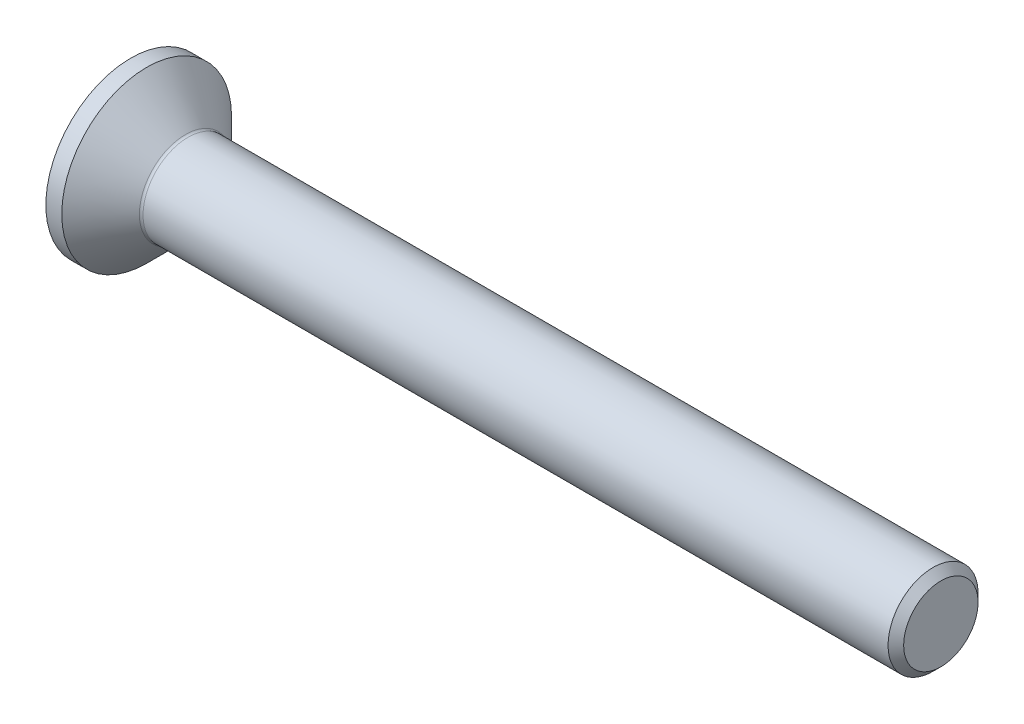
ISO-10303-21;
HEADER;
FILE_DESCRIPTION(('STEP AP214'),'2;1');
FILE_NAME('part.step','',(''),(''),'','','');
FILE_SCHEMA(('AUTOMOTIVE_DESIGN { 1 0 10303 214 1 1 1 1 }'));
ENDSEC;
DATA;
#1=APPLICATION_CONTEXT('core data for automotive mechanical design processes');
#2=APPLICATION_PROTOCOL_DEFINITION('international standard','automotive_design',2000,#1);
#3=PRODUCT_CONTEXT('',#1,'mechanical');
#4=PRODUCT('Part','Part','',(#3));
#5=PRODUCT_RELATED_PRODUCT_CATEGORY('part','',(#4));
#6=PRODUCT_DEFINITION_FORMATION('','',#4);
#7=PRODUCT_DEFINITION_CONTEXT('part definition',#1,'design');
#8=PRODUCT_DEFINITION('design','',#6,#7);
#9=PRODUCT_DEFINITION_SHAPE('','',#8);
#10=(LENGTH_UNIT() NAMED_UNIT(*) SI_UNIT(.MILLI.,.METRE.));
#11=(NAMED_UNIT(*) PLANE_ANGLE_UNIT() SI_UNIT($,.RADIAN.));
#12=(NAMED_UNIT(*) SI_UNIT($,.STERADIAN.) SOLID_ANGLE_UNIT());
#13=UNCERTAINTY_MEASURE_WITH_UNIT(LENGTH_MEASURE(1.E-05),#10,'distance_accuracy_value','');
#14=(GEOMETRIC_REPRESENTATION_CONTEXT(3) GLOBAL_UNCERTAINTY_ASSIGNED_CONTEXT((#13)) GLOBAL_UNIT_ASSIGNED_CONTEXT((#10,
#11,#12)) REPRESENTATION_CONTEXT('',''));
#15=CARTESIAN_POINT('',(0.,0.,0.));
#16=DIRECTION('',(0.,0.,1.));
#17=DIRECTION('',(1.,0.,0.));
#18=AXIS2_PLACEMENT_3D('',#15,#16,#17);
#19=CARTESIAN_POINT('',(3.1,0.,0.));
#20=DIRECTION('',(-1.,0.,0.));
#21=DIRECTION('',(0.,0.,1.));
#22=AXIS2_PLACEMENT_3D('',#19,#20,#21);
#23=CONICAL_SURFACE('',#22,2.5,0.785398163397448);
#24=CARTESIAN_POINT('',(0.884999999999991,0.,0.));
#25=DIRECTION('',(-1.,0.,0.));
#26=DIRECTION('',(0.,0.,1.));
#27=AXIS2_PLACEMENT_3D('',#24,#25,#26);
#28=CIRCLE('',#27,4.715);
#29=CARTESIAN_POINT('',(0.884999999999991,0.,4.715));
#30=VERTEX_POINT('',#29);
#31=EDGE_CURVE('E42',#30,#30,#28,.F.);
#32=ORIENTED_EDGE('',*,*,#31,.T.);
#33=EDGE_LOOP('',(#32));
#34=FACE_BOUND('',#33,.T.);
#35=CARTESIAN_POINT('',(3.04142135623731,0.,0.));
#36=DIRECTION('',(-1.,0.,0.));
#37=DIRECTION('',(0.,0.,1.));
#38=AXIS2_PLACEMENT_3D('',#35,#36,#37);
#39=CIRCLE('',#38,2.55857864376269);
#40=CARTESIAN_POINT('',(3.04142135623731,0.,2.55857864376269));
#41=VERTEX_POINT('',#40);
#42=EDGE_CURVE('E161',#41,#41,#39,.T.);
#43=ORIENTED_EDGE('',*,*,#42,.T.);
#44=EDGE_LOOP('',(#43));
#45=FACE_BOUND('',#44,.T.);
#46=ADVANCED_FACE('F38',(#34,#45),#23,.T.);
#47=CARTESIAN_POINT('',(-0.587069180985524,0.,0.));
#48=DIRECTION('',(-1.,0.,0.));
#49=DIRECTION('',(0.,0.,1.));
#50=AXIS2_PLACEMENT_3D('',#47,#48,#49);
#51=CYLINDRICAL_SURFACE('',#50,2.5);
#52=CARTESIAN_POINT('',(44.567,0.,0.));
#53=DIRECTION('',(-1.,0.,0.));
#54=DIRECTION('',(0.,0.,1.));
#55=AXIS2_PLACEMENT_3D('',#52,#53,#54);
#56=CIRCLE('',#55,2.5);
#57=CARTESIAN_POINT('',(44.567,0.,2.5));
#58=VERTEX_POINT('',#57);
#59=EDGE_CURVE('E47',#58,#58,#56,.T.);
#60=ORIENTED_EDGE('',*,*,#59,.T.);
#61=EDGE_LOOP('',(#60));
#62=FACE_BOUND('',#61,.T.);
#63=CARTESIAN_POINT('',(3.18284271247462,0.,0.));
#64=DIRECTION('',(-1.,0.,0.));
#65=DIRECTION('',(0.,0.,1.));
#66=AXIS2_PLACEMENT_3D('',#63,#64,#65);
#67=CIRCLE('',#66,2.5);
#68=CARTESIAN_POINT('',(3.18284271247462,0.,2.5));
#69=VERTEX_POINT('',#68);
#70=EDGE_CURVE('E158',#69,#69,#67,.F.);
#71=ORIENTED_EDGE('',*,*,#70,.T.);
#72=EDGE_LOOP('',(#71));
#73=FACE_BOUND('',#72,.T.);
#74=ADVANCED_FACE('F129',(#62,#73),#51,.T.);
#75=CARTESIAN_POINT('',(45.,2.5,0.));
#76=DIRECTION('',(-1.,0.,0.));
#77=DIRECTION('',(0.,0.,1.));
#78=AXIS2_PLACEMENT_3D('',#75,#76,#77);
#79=PLANE('',#78);
#80=CARTESIAN_POINT('',(45.,0.,0.));
#81=DIRECTION('',(-1.,0.,0.));
#82=DIRECTION('',(0.,0.,1.));
#83=AXIS2_PLACEMENT_3D('',#80,#81,#82);
#84=CIRCLE('',#83,2.06699999999999);
#85=CARTESIAN_POINT('',(45.,0.,2.06699999999999));
#86=VERTEX_POINT('',#85);
#87=EDGE_CURVE('E11',#86,#86,#84,.F.);
#88=ORIENTED_EDGE('',*,*,#87,.T.);
#89=EDGE_LOOP('',(#88));
#90=FACE_BOUND('',#89,.T.);
#91=ADVANCED_FACE('F135',(#90),#79,.F.);
#92=CARTESIAN_POINT('',(3.18284271247462,0.,0.));
#93=DIRECTION('',(-1.,0.,0.));
#94=DIRECTION('',(0.,0.,1.));
#95=AXIS2_PLACEMENT_3D('',#92,#93,#94);
#96=TOROIDAL_SURFACE('',#95,2.7,0.2);
#97=ORIENTED_EDGE('',*,*,#70,.F.);
#98=EDGE_LOOP('',(#97));
#99=FACE_BOUND('',#98,.T.);
#100=ORIENTED_EDGE('',*,*,#42,.F.);
#101=EDGE_LOOP('',(#100));
#102=FACE_BOUND('',#101,.T.);
#103=ADVANCED_FACE('F146',(#99,#102),#96,.F.);
#104=CARTESIAN_POINT('',(44.567,0.,0.));
#105=DIRECTION('',(-1.,0.,0.));
#106=DIRECTION('',(0.,0.,1.));
#107=AXIS2_PLACEMENT_3D('',#104,#105,#106);
#108=CONICAL_SURFACE('',#107,2.5,0.78539816339744);
#109=ORIENTED_EDGE('',*,*,#87,.F.);
#110=EDGE_LOOP('',(#109));
#111=FACE_BOUND('',#110,.T.);
#112=ORIENTED_EDGE('',*,*,#59,.F.);
#113=EDGE_LOOP('',(#112));
#114=FACE_BOUND('',#113,.T.);
#115=ADVANCED_FACE('F40',(#111,#114),#108,.T.);
#116=CARTESIAN_POINT('',(11.8531386861314,0.,0.));
#117=DIRECTION('',(1.,0.,0.));
#118=DIRECTION('',(0.,0.,-1.));
#119=AXIS2_PLACEMENT_3D('',#116,#117,#118);
#120=CYLINDRICAL_SURFACE('',#119,4.715);
#121=ORIENTED_EDGE('',*,*,#31,.F.);
#122=EDGE_LOOP('',(#121));
#123=FACE_BOUND('',#122,.T.);
#124=CARTESIAN_POINT('',(0.,0.,0.));
#125=DIRECTION('',(1.,0.,0.));
#126=DIRECTION('',(0.,0.,-1.));
#127=AXIS2_PLACEMENT_3D('',#124,#125,#126);
#128=CIRCLE('',#127,4.715);
#129=CARTESIAN_POINT('',(0.,0.,-4.715));
#130=VERTEX_POINT('',#129);
#131=EDGE_CURVE('E227',#130,#130,#128,.F.);
#132=ORIENTED_EDGE('',*,*,#131,.F.);
#133=EDGE_LOOP('',(#132));
#134=FACE_BOUND('',#133,.T.);
#135=ADVANCED_FACE('F116',(#123,#134),#120,.T.);
#136=CARTESIAN_POINT('',(2.76602540378444,0.,0.));
#137=DIRECTION('',(-1.,0.,0.));
#138=DIRECTION('',(0.,0.,1.));
#139=AXIS2_PLACEMENT_3D('',#136,#137,#138);
#140=CONICAL_SURFACE('',#139,0.,1.0471975511966);
#141=CARTESIAN_POINT('',(1.9,0.,0.));
#142=DIRECTION('',(-1.,0.,0.));
#143=DIRECTION('',(0.,0.,1.));
#144=AXIS2_PLACEMENT_3D('',#141,#142,#143);
#145=CIRCLE('',#144,1.5);
#146=CARTESIAN_POINT('',(1.9,0.75,1.29903810567666));
#147=VERTEX_POINT('',#146);
#148=CARTESIAN_POINT('',(1.9,1.5,0.));
#149=VERTEX_POINT('',#148);
#150=EDGE_CURVE('E167',#147,#149,#145,.T.);
#151=ORIENTED_EDGE('',*,*,#150,.T.);
#152=CARTESIAN_POINT('',(1.9,0.750000000000001,-1.29903810567666));
#153=VERTEX_POINT('',#152);
#154=EDGE_CURVE('E162',#149,#153,#145,.T.);
#155=ORIENTED_EDGE('',*,*,#154,.T.);
#156=CARTESIAN_POINT('',(1.9,-0.75,-1.29903810567666));
#157=VERTEX_POINT('',#156);
#158=EDGE_CURVE('E165',#153,#157,#145,.T.);
#159=ORIENTED_EDGE('',*,*,#158,.T.);
#160=CARTESIAN_POINT('',(1.9,-1.5,0.));
#161=VERTEX_POINT('',#160);
#162=EDGE_CURVE('E246',#157,#161,#145,.T.);
#163=ORIENTED_EDGE('',*,*,#162,.T.);
#164=CARTESIAN_POINT('',(1.9,-0.75,1.29903810567666));
#165=VERTEX_POINT('',#164);
#166=EDGE_CURVE('E54',#161,#165,#145,.T.);
#167=ORIENTED_EDGE('',*,*,#166,.T.);
#168=EDGE_CURVE('E176',#165,#147,#145,.T.);
#169=ORIENTED_EDGE('',*,*,#168,.T.);
#170=EDGE_LOOP('',(#151,#155,#159,#163,#167,#169));
#171=FACE_BOUND('',#170,.T.);
#172=CARTESIAN_POINT('',(2.76602540378444,0.,0.));
#173=VERTEX_POINT('',#172);
#174=VERTEX_LOOP('',#173);
#175=FACE_BOUND('',#174,.T.);
#176=ADVANCED_FACE('F113',(#171,#175),#140,.F.);
#177=CARTESIAN_POINT('',(1.9,0.,-1.73205080756888));
#178=DIRECTION('',(1.,0.,0.));
#179=DIRECTION('',(0.,0.,-1.));
#180=AXIS2_PLACEMENT_3D('',#177,#178,#179);
#181=PLANE('',#180);
#182=ORIENTED_EDGE('',*,*,#166,.F.);
#183=DIRECTION('',(0.,0.,-1.));
#184=VECTOR('',#183,1.);
#185=CARTESIAN_POINT('',(1.9,-1.5,0.866025403784438));
#186=LINE('',#185,#184);
#187=CARTESIAN_POINT('',(1.9,-1.5,0.866025403784438));
#188=VERTEX_POINT('',#187);
#189=EDGE_CURVE('E187',#188,#161,#186,.T.);
#190=ORIENTED_EDGE('',*,*,#189,.F.);
#191=DIRECTION('',(0.,-0.866025403784439,-0.5));
#192=VECTOR('',#191,1.);
#193=CARTESIAN_POINT('',(1.9,0.,1.73205080756888));
#194=LINE('',#193,#192);
#195=EDGE_CURVE('E211',#165,#188,#194,.T.);
#196=ORIENTED_EDGE('',*,*,#195,.F.);
#197=EDGE_LOOP('',(#182,#190,#196));
#198=FACE_BOUND('',#197,.T.);
#199=ADVANCED_FACE('F115',(#198),#181,.F.);
#200=ORIENTED_EDGE('',*,*,#168,.F.);
#201=CARTESIAN_POINT('',(1.9,0.,1.73205080756888));
#202=VERTEX_POINT('',#201);
#203=EDGE_CURVE('E208',#202,#165,#194,.T.);
#204=ORIENTED_EDGE('',*,*,#203,.F.);
#205=DIRECTION('',(0.,-0.866025403784439,0.5));
#206=VECTOR('',#205,1.);
#207=CARTESIAN_POINT('',(1.9,1.5,0.866025403784438));
#208=LINE('',#207,#206);
#209=EDGE_CURVE('E215',#147,#202,#208,.T.);
#210=ORIENTED_EDGE('',*,*,#209,.F.);
#211=EDGE_LOOP('',(#200,#204,#210));
#212=FACE_BOUND('',#211,.T.);
#213=ADVANCED_FACE('F122',(#212),#181,.F.);
#214=ORIENTED_EDGE('',*,*,#150,.F.);
#215=CARTESIAN_POINT('',(1.9,1.5,0.866025403784438));
#216=VERTEX_POINT('',#215);
#217=EDGE_CURVE('E212',#216,#147,#208,.T.);
#218=ORIENTED_EDGE('',*,*,#217,.F.);
#219=DIRECTION('',(0.,0.,1.));
#220=VECTOR('',#219,1.);
#221=CARTESIAN_POINT('',(1.9,1.5,-0.866025403784439));
#222=LINE('',#221,#220);
#223=EDGE_CURVE('E219',#149,#216,#222,.T.);
#224=ORIENTED_EDGE('',*,*,#223,.F.);
#225=EDGE_LOOP('',(#214,#218,#224));
#226=FACE_BOUND('',#225,.T.);
#227=ADVANCED_FACE('F277',(#226),#181,.F.);
#228=ORIENTED_EDGE('',*,*,#154,.F.);
#229=CARTESIAN_POINT('',(1.9,1.5,-0.866025403784439));
#230=VERTEX_POINT('',#229);
#231=EDGE_CURVE('E216',#230,#149,#222,.T.);
#232=ORIENTED_EDGE('',*,*,#231,.F.);
#233=DIRECTION('',(0.,0.866025403784438,0.5));
#234=VECTOR('',#233,1.);
#235=CARTESIAN_POINT('',(1.9,0.,-1.73205080756888));
#236=LINE('',#235,#234);
#237=EDGE_CURVE('E223',#153,#230,#236,.T.);
#238=ORIENTED_EDGE('',*,*,#237,.F.);
#239=EDGE_LOOP('',(#228,#232,#238));
#240=FACE_BOUND('',#239,.T.);
#241=ADVANCED_FACE('F282',(#240),#181,.F.);
#242=ORIENTED_EDGE('',*,*,#158,.F.);
#243=CARTESIAN_POINT('',(1.9,0.,-1.73205080756888));
#244=VERTEX_POINT('',#243);
#245=EDGE_CURVE('E220',#244,#153,#236,.T.);
#246=ORIENTED_EDGE('',*,*,#245,.F.);
#247=DIRECTION('',(0.,0.866025403784439,-0.5));
#248=VECTOR('',#247,1.);
#249=CARTESIAN_POINT('',(1.9,-1.5,-0.86602540378444));
#250=LINE('',#249,#248);
#251=EDGE_CURVE('E191',#157,#244,#250,.T.);
#252=ORIENTED_EDGE('',*,*,#251,.F.);
#253=EDGE_LOOP('',(#242,#246,#252));
#254=FACE_BOUND('',#253,.T.);
#255=ADVANCED_FACE('F251',(#254),#181,.F.);
#256=ORIENTED_EDGE('',*,*,#162,.F.);
#257=CARTESIAN_POINT('',(1.9,-1.5,-0.86602540378444));
#258=VERTEX_POINT('',#257);
#259=EDGE_CURVE('E224',#258,#157,#250,.T.);
#260=ORIENTED_EDGE('',*,*,#259,.F.);
#261=EDGE_CURVE('E207',#161,#258,#186,.T.);
#262=ORIENTED_EDGE('',*,*,#261,.F.);
#263=EDGE_LOOP('',(#256,#260,#262));
#264=FACE_BOUND('',#263,.T.);
#265=ADVANCED_FACE('F125',(#264),#181,.F.);
#266=CARTESIAN_POINT('',(1.9,-1.5,0.866025403784438));
#267=DIRECTION('',(0.,1.,0.));
#268=DIRECTION('',(0.,0.,1.));
#269=AXIS2_PLACEMENT_3D('',#266,#267,#268);
#270=PLANE('',#269);
#271=DIRECTION('',(0.,0.,-1.));
#272=VECTOR('',#271,1.);
#273=CARTESIAN_POINT('',(0.,-1.5,0.866025403784438));
#274=LINE('',#273,#272);
#275=CARTESIAN_POINT('',(0.,-1.5,0.866025403784438));
#276=VERTEX_POINT('',#275);
#277=CARTESIAN_POINT('',(0.,-1.5,-0.86602540378444));
#278=VERTEX_POINT('',#277);
#279=EDGE_CURVE('E188',#276,#278,#274,.T.);
#280=ORIENTED_EDGE('',*,*,#279,.F.);
#281=DIRECTION('',(-1.,0.,0.));
#282=VECTOR('',#281,1.);
#283=CARTESIAN_POINT('',(1.9,-1.5,0.866025403784438));
#284=LINE('',#283,#282);
#285=EDGE_CURVE('E183',#188,#276,#284,.T.);
#286=ORIENTED_EDGE('',*,*,#285,.F.);
#287=ORIENTED_EDGE('',*,*,#189,.T.);
#288=ORIENTED_EDGE('',*,*,#261,.T.);
#289=DIRECTION('',(-1.,0.,0.));
#290=VECTOR('',#289,1.);
#291=CARTESIAN_POINT('',(1.9,-1.5,-0.86602540378444));
#292=LINE('',#291,#290);
#293=EDGE_CURVE('E185',#258,#278,#292,.T.);
#294=ORIENTED_EDGE('',*,*,#293,.T.);
#295=EDGE_LOOP('',(#280,#286,#287,#288,#294));
#296=FACE_BOUND('',#295,.T.);
#297=ADVANCED_FACE('F240',(#296),#270,.T.);
#298=CARTESIAN_POINT('',(1.9,0.,1.73205080756888));
#299=DIRECTION('',(0.,0.5,-0.866025403784438));
#300=DIRECTION('',(0.,0.866025403784438,0.5));
#301=AXIS2_PLACEMENT_3D('',#298,#299,#300);
#302=PLANE('',#301);
#303=DIRECTION('',(0.,-0.866025403784439,-0.5));
#304=VECTOR('',#303,1.);
#305=CARTESIAN_POINT('',(0.,0.,1.73205080756888));
#306=LINE('',#305,#304);
#307=CARTESIAN_POINT('',(0.,0.,1.73205080756888));
#308=VERTEX_POINT('',#307);
#309=EDGE_CURVE('E192',#308,#276,#306,.T.);
#310=ORIENTED_EDGE('',*,*,#309,.F.);
#311=DIRECTION('',(-1.,0.,0.));
#312=VECTOR('',#311,1.);
#313=CARTESIAN_POINT('',(1.9,0.,1.73205080756888));
#314=LINE('',#313,#312);
#315=EDGE_CURVE('E181',#202,#308,#314,.T.);
#316=ORIENTED_EDGE('',*,*,#315,.F.);
#317=ORIENTED_EDGE('',*,*,#203,.T.);
#318=ORIENTED_EDGE('',*,*,#195,.T.);
#319=ORIENTED_EDGE('',*,*,#285,.T.);
#320=EDGE_LOOP('',(#310,#316,#317,#318,#319));
#321=FACE_BOUND('',#320,.T.);
#322=ADVANCED_FACE('F270',(#321),#302,.T.);
#323=CARTESIAN_POINT('',(1.9,1.5,0.866025403784438));
#324=DIRECTION('',(0.,-0.5,-0.866025403784438));
#325=DIRECTION('',(0.,0.866025403784439,-0.5));
#326=AXIS2_PLACEMENT_3D('',#323,#324,#325);
#327=PLANE('',#326);
#328=DIRECTION('',(0.,-0.866025403784439,0.5));
#329=VECTOR('',#328,1.);
#330=CARTESIAN_POINT('',(0.,1.5,0.866025403784438));
#331=LINE('',#330,#329);
#332=CARTESIAN_POINT('',(0.,1.5,0.866025403784438));
#333=VERTEX_POINT('',#332);
#334=EDGE_CURVE('E195',#333,#308,#331,.T.);
#335=ORIENTED_EDGE('',*,*,#334,.F.);
#336=DIRECTION('',(-1.,0.,0.));
#337=VECTOR('',#336,1.);
#338=CARTESIAN_POINT('',(1.9,1.5,0.866025403784438));
#339=LINE('',#338,#337);
#340=EDGE_CURVE('E179',#216,#333,#339,.T.);
#341=ORIENTED_EDGE('',*,*,#340,.F.);
#342=ORIENTED_EDGE('',*,*,#217,.T.);
#343=ORIENTED_EDGE('',*,*,#209,.T.);
#344=ORIENTED_EDGE('',*,*,#315,.T.);
#345=EDGE_LOOP('',(#335,#341,#342,#343,#344));
#346=FACE_BOUND('',#345,.T.);
#347=ADVANCED_FACE('F264',(#346),#327,.T.);
#348=CARTESIAN_POINT('',(1.9,1.5,-0.866025403784439));
#349=DIRECTION('',(0.,-1.,0.));
#350=DIRECTION('',(0.,0.,-1.));
#351=AXIS2_PLACEMENT_3D('',#348,#349,#350);
#352=PLANE('',#351);
#353=DIRECTION('',(0.,0.,1.));
#354=VECTOR('',#353,1.);
#355=CARTESIAN_POINT('',(0.,1.5,-0.866025403784439));
#356=LINE('',#355,#354);
#357=CARTESIAN_POINT('',(0.,1.5,-0.866025403784439));
#358=VERTEX_POINT('',#357);
#359=EDGE_CURVE('E198',#358,#333,#356,.T.);
#360=ORIENTED_EDGE('',*,*,#359,.F.);
#361=DIRECTION('',(-1.,0.,0.));
#362=VECTOR('',#361,1.);
#363=CARTESIAN_POINT('',(1.9,1.5,-0.866025403784439));
#364=LINE('',#363,#362);
#365=EDGE_CURVE('E177',#230,#358,#364,.T.);
#366=ORIENTED_EDGE('',*,*,#365,.F.);
#367=ORIENTED_EDGE('',*,*,#231,.T.);
#368=ORIENTED_EDGE('',*,*,#223,.T.);
#369=ORIENTED_EDGE('',*,*,#340,.T.);
#370=EDGE_LOOP('',(#360,#366,#367,#368,#369));
#371=FACE_BOUND('',#370,.T.);
#372=ADVANCED_FACE('F260',(#371),#352,.T.);
#373=CARTESIAN_POINT('',(1.9,0.,-1.73205080756888));
#374=DIRECTION('',(0.,-0.5,0.866025403784438));
#375=DIRECTION('',(0.,-0.866025403784438,-0.5));
#376=AXIS2_PLACEMENT_3D('',#373,#374,#375);
#377=PLANE('',#376);
#378=DIRECTION('',(0.,0.866025403784438,0.5));
#379=VECTOR('',#378,1.);
#380=CARTESIAN_POINT('',(0.,0.,-1.73205080756888));
#381=LINE('',#380,#379);
#382=CARTESIAN_POINT('',(0.,0.,-1.73205080756888));
#383=VERTEX_POINT('',#382);
#384=EDGE_CURVE('E201',#383,#358,#381,.T.);
#385=ORIENTED_EDGE('',*,*,#384,.F.);
#386=DIRECTION('',(-1.,0.,0.));
#387=VECTOR('',#386,1.);
#388=CARTESIAN_POINT('',(1.9,0.,-1.73205080756888));
#389=LINE('',#388,#387);
#390=EDGE_CURVE('E169',#244,#383,#389,.T.);
#391=ORIENTED_EDGE('',*,*,#390,.F.);
#392=ORIENTED_EDGE('',*,*,#245,.T.);
#393=ORIENTED_EDGE('',*,*,#237,.T.);
#394=ORIENTED_EDGE('',*,*,#365,.T.);
#395=EDGE_LOOP('',(#385,#391,#392,#393,#394));
#396=FACE_BOUND('',#395,.T.);
#397=ADVANCED_FACE('F255',(#396),#377,.T.);
#398=CARTESIAN_POINT('',(1.9,-1.5,-0.86602540378444));
#399=DIRECTION('',(0.,0.5,0.866025403784439));
#400=DIRECTION('',(0.,-0.866025403784439,0.5));
#401=AXIS2_PLACEMENT_3D('',#398,#399,#400);
#402=PLANE('',#401);
#403=DIRECTION('',(0.,0.866025403784439,-0.5));
#404=VECTOR('',#403,1.);
#405=CARTESIAN_POINT('',(0.,-1.5,-0.86602540378444));
#406=LINE('',#405,#404);
#407=EDGE_CURVE('E62',#278,#383,#406,.T.);
#408=ORIENTED_EDGE('',*,*,#407,.F.);
#409=ORIENTED_EDGE('',*,*,#293,.F.);
#410=ORIENTED_EDGE('',*,*,#259,.T.);
#411=ORIENTED_EDGE('',*,*,#251,.T.);
#412=ORIENTED_EDGE('',*,*,#390,.T.);
#413=EDGE_LOOP('',(#408,#409,#410,#411,#412));
#414=FACE_BOUND('',#413,.T.);
#415=ADVANCED_FACE('F144',(#414),#402,.T.);
#416=CARTESIAN_POINT('',(0.,0.,0.));
#417=DIRECTION('',(1.,0.,0.));
#418=DIRECTION('',(0.,0.,-1.));
#419=AXIS2_PLACEMENT_3D('',#416,#417,#418);
#420=PLANE('',#419);
#421=ORIENTED_EDGE('',*,*,#131,.T.);
#422=EDGE_LOOP('',(#421));
#423=FACE_BOUND('',#422,.T.);
#424=ORIENTED_EDGE('',*,*,#407,.T.);
#425=ORIENTED_EDGE('',*,*,#384,.T.);
#426=ORIENTED_EDGE('',*,*,#359,.T.);
#427=ORIENTED_EDGE('',*,*,#334,.T.);
#428=ORIENTED_EDGE('',*,*,#309,.T.);
#429=ORIENTED_EDGE('',*,*,#279,.T.);
#430=EDGE_LOOP('',(#424,#425,#426,#427,#428,#429));
#431=FACE_BOUND('',#430,.T.);
#432=ADVANCED_FACE('F142',(#423,#431),#420,.F.);
#433=CLOSED_SHELL('',(#46,#74,#91,#103,#115,#135,#176,#199,#213,#227,#241,#255,#265,#297,#322,
#347,#372,#397,#415,#432));
#434=MANIFOLD_SOLID_BREP('B2',#433);
#435=ADVANCED_BREP_SHAPE_REPRESENTATION('',(#18,#434),#14);
#436=SHAPE_DEFINITION_REPRESENTATION(#9,#435);
ENDSEC;
END-ISO-10303-21;
